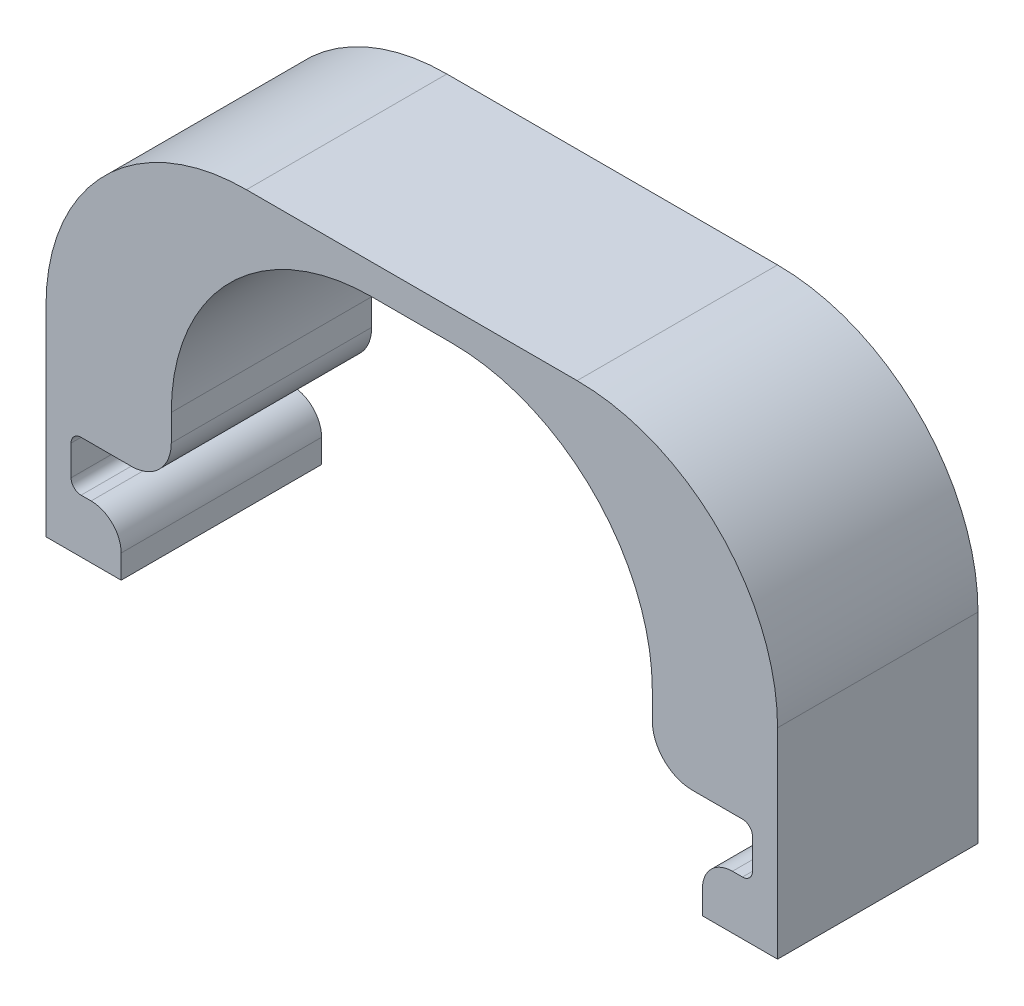
ISO-10303-21;
HEADER;
FILE_DESCRIPTION(('STEP AP214'),'2;1');
FILE_NAME('part.step','',(''),(''),'','','');
FILE_SCHEMA(('AUTOMOTIVE_DESIGN { 1 0 10303 214 1 1 1 1 }'));
ENDSEC;
DATA;
#1=APPLICATION_CONTEXT('core data for automotive mechanical design processes');
#2=APPLICATION_PROTOCOL_DEFINITION('international standard','automotive_design',2000,#1);
#3=PRODUCT_CONTEXT('',#1,'mechanical');
#4=PRODUCT('Part','Part','',(#3));
#5=PRODUCT_RELATED_PRODUCT_CATEGORY('part','',(#4));
#6=PRODUCT_DEFINITION_FORMATION('','',#4);
#7=PRODUCT_DEFINITION_CONTEXT('part definition',#1,'design');
#8=PRODUCT_DEFINITION('design','',#6,#7);
#9=PRODUCT_DEFINITION_SHAPE('','',#8);
#10=(LENGTH_UNIT() NAMED_UNIT(*) SI_UNIT(.MILLI.,.METRE.));
#11=(NAMED_UNIT(*) PLANE_ANGLE_UNIT() SI_UNIT($,.RADIAN.));
#12=(NAMED_UNIT(*) SI_UNIT($,.STERADIAN.) SOLID_ANGLE_UNIT());
#13=UNCERTAINTY_MEASURE_WITH_UNIT(LENGTH_MEASURE(1.E-05),#10,'distance_accuracy_value','');
#14=(GEOMETRIC_REPRESENTATION_CONTEXT(3) GLOBAL_UNCERTAINTY_ASSIGNED_CONTEXT((#13)) GLOBAL_UNIT_ASSIGNED_CONTEXT((#10,
#11,#12)) REPRESENTATION_CONTEXT('',''));
#15=CARTESIAN_POINT('',(0.,0.,0.));
#16=DIRECTION('',(0.,0.,1.));
#17=DIRECTION('',(1.,0.,0.));
#18=AXIS2_PLACEMENT_3D('',#15,#16,#17);
#19=CARTESIAN_POINT('',(0.,0.,0.));
#20=DIRECTION('',(0.,1.,0.));
#21=DIRECTION('',(0.,0.,1.));
#22=AXIS2_PLACEMENT_3D('',#19,#20,#21);
#23=PLANE('',#22);
#24=DIRECTION('',(-1.,0.,0.));
#25=VECTOR('',#24,1.);
#26=CARTESIAN_POINT('',(36.5,0.,-10.));
#27=LINE('',#26,#25);
#28=CARTESIAN_POINT('',(-29.,0.,-10.));
#29=VERTEX_POINT('',#28);
#30=CARTESIAN_POINT('',(-36.5,0.,-9.99999999999999));
#31=VERTEX_POINT('',#30);
#32=EDGE_CURVE('E466',#29,#31,#27,.T.);
#33=ORIENTED_EDGE('',*,*,#32,.F.);
#34=DIRECTION('',(0.,0.,1.));
#35=VECTOR('',#34,1.);
#36=CARTESIAN_POINT('',(-29.,0.,-10.));
#37=LINE('',#36,#35);
#38=CARTESIAN_POINT('',(-29.,0.,10.));
#39=VERTEX_POINT('',#38);
#40=EDGE_CURVE('E393',#29,#39,#37,.T.);
#41=ORIENTED_EDGE('',*,*,#40,.T.);
#42=DIRECTION('',(1.,0.,0.));
#43=VECTOR('',#42,1.);
#44=CARTESIAN_POINT('',(36.5,0.,10.));
#45=LINE('',#44,#43);
#46=CARTESIAN_POINT('',(-36.5,0.,10.));
#47=VERTEX_POINT('',#46);
#48=EDGE_CURVE('E458',#47,#39,#45,.T.);
#49=ORIENTED_EDGE('',*,*,#48,.F.);
#50=DIRECTION('',(0.,0.,1.));
#51=VECTOR('',#50,1.);
#52=CARTESIAN_POINT('',(-36.5,0.,10.));
#53=LINE('',#52,#51);
#54=EDGE_CURVE('E397',#31,#47,#53,.T.);
#55=ORIENTED_EDGE('',*,*,#54,.F.);
#56=EDGE_LOOP('',(#33,#41,#49,#55));
#57=FACE_BOUND('',#56,.T.);
#58=ADVANCED_FACE('F43',(#57),#23,.F.);
#59=CARTESIAN_POINT('',(-36.5,40.,10.));
#60=DIRECTION('',(1.,0.,0.));
#61=DIRECTION('',(0.,0.,-1.));
#62=AXIS2_PLACEMENT_3D('',#59,#60,#61);
#63=PLANE('',#62);
#64=DIRECTION('',(0.,-1.,0.));
#65=VECTOR('',#64,1.);
#66=CARTESIAN_POINT('',(-36.5,40.,10.));
#67=LINE('',#66,#65);
#68=CARTESIAN_POINT('',(-36.5,20.,10.));
#69=VERTEX_POINT('',#68);
#70=EDGE_CURVE('E477',#69,#47,#67,.T.);
#71=ORIENTED_EDGE('',*,*,#70,.F.);
#72=DIRECTION('',(0.,0.,1.));
#73=VECTOR('',#72,1.);
#74=CARTESIAN_POINT('',(-36.5,20.,-9.99999999999999));
#75=LINE('',#74,#73);
#76=CARTESIAN_POINT('',(-36.5,20.,-9.99999999999999));
#77=VERTEX_POINT('',#76);
#78=EDGE_CURVE('E503',#69,#77,#75,.F.);
#79=ORIENTED_EDGE('',*,*,#78,.T.);
#80=DIRECTION('',(0.,-1.,0.));
#81=VECTOR('',#80,1.);
#82=CARTESIAN_POINT('',(-36.5,40.,-9.99999999999999));
#83=LINE('',#82,#81);
#84=EDGE_CURVE('E453',#77,#31,#83,.T.);
#85=ORIENTED_EDGE('',*,*,#84,.T.);
#86=ORIENTED_EDGE('',*,*,#54,.T.);
#87=EDGE_LOOP('',(#71,#79,#85,#86));
#88=FACE_BOUND('',#87,.T.);
#89=ADVANCED_FACE('F578',(#88),#63,.F.);
#90=CARTESIAN_POINT('',(36.5,40.,10.));
#91=DIRECTION('',(0.,0.,-1.));
#92=DIRECTION('',(-1.,0.,0.));
#93=AXIS2_PLACEMENT_3D('',#90,#91,#92);
#94=PLANE('',#93);
#95=DIRECTION('',(0.,-1.,0.));
#96=VECTOR('',#95,1.);
#97=CARTESIAN_POINT('',(36.5,40.,10.));
#98=LINE('',#97,#96);
#99=CARTESIAN_POINT('',(36.5,20.,10.));
#100=VERTEX_POINT('',#99);
#101=CARTESIAN_POINT('',(36.5,0.,10.));
#102=VERTEX_POINT('',#101);
#103=EDGE_CURVE('E474',#100,#102,#98,.T.);
#104=ORIENTED_EDGE('',*,*,#103,.F.);
#105=CARTESIAN_POINT('',(16.5,20.,10.));
#106=DIRECTION('',(0.,0.,-1.));
#107=DIRECTION('',(-1.,0.,0.));
#108=AXIS2_PLACEMENT_3D('',#105,#106,#107);
#109=CIRCLE('',#108,20.);
#110=CARTESIAN_POINT('',(16.5,40.,10.));
#111=VERTEX_POINT('',#110);
#112=EDGE_CURVE('E500',#100,#111,#109,.F.);
#113=ORIENTED_EDGE('',*,*,#112,.T.);
#114=DIRECTION('',(1.,0.,0.));
#115=VECTOR('',#114,1.);
#116=CARTESIAN_POINT('',(36.5,40.,10.));
#117=LINE('',#116,#115);
#118=CARTESIAN_POINT('',(-16.5,40.,10.));
#119=VERTEX_POINT('',#118);
#120=EDGE_CURVE('E445',#119,#111,#117,.T.);
#121=ORIENTED_EDGE('',*,*,#120,.F.);
#122=CARTESIAN_POINT('',(-16.5,20.,10.));
#123=DIRECTION('',(0.,0.,-1.));
#124=DIRECTION('',(-1.,0.,0.));
#125=AXIS2_PLACEMENT_3D('',#122,#123,#124);
#126=CIRCLE('',#125,20.);
#127=EDGE_CURVE('E497',#119,#69,#126,.F.);
#128=ORIENTED_EDGE('',*,*,#127,.T.);
#129=ORIENTED_EDGE('',*,*,#70,.T.);
#130=ORIENTED_EDGE('',*,*,#48,.T.);
#131=DIRECTION('',(0.,-1.,0.));
#132=VECTOR('',#131,1.);
#133=CARTESIAN_POINT('',(-29.,0.,10.));
#134=LINE('',#133,#132);
#135=CARTESIAN_POINT('',(-29.,2.35242143726312,10.));
#136=VERTEX_POINT('',#135);
#137=EDGE_CURVE('E256',#136,#39,#134,.T.);
#138=ORIENTED_EDGE('',*,*,#137,.F.);
#139=CARTESIAN_POINT('',(-32.,2.35242143726312,10.));
#140=DIRECTION('',(0.,0.,-1.));
#141=DIRECTION('',(1.,0.,0.));
#142=AXIS2_PLACEMENT_3D('',#139,#140,#141);
#143=CIRCLE('',#142,3.);
#144=CARTESIAN_POINT('',(-32.,5.35242143726311,10.));
#145=VERTEX_POINT('',#144);
#146=EDGE_CURVE('E259',#145,#136,#143,.T.);
#147=ORIENTED_EDGE('',*,*,#146,.F.);
#148=DIRECTION('',(1.,0.,0.));
#149=VECTOR('',#148,1.);
#150=CARTESIAN_POINT('',(-32.,5.35242143726312,10.));
#151=LINE('',#150,#149);
#152=CARTESIAN_POINT('',(-33.,5.35242143726312,10.));
#153=VERTEX_POINT('',#152);
#154=EDGE_CURVE('E386',#153,#145,#151,.T.);
#155=ORIENTED_EDGE('',*,*,#154,.F.);
#156=CARTESIAN_POINT('',(-33.,6.35242143726312,10.));
#157=DIRECTION('',(0.,0.,1.));
#158=DIRECTION('',(-1.,0.,0.));
#159=AXIS2_PLACEMENT_3D('',#156,#157,#158);
#160=CIRCLE('',#159,1.);
#161=CARTESIAN_POINT('',(-34.,6.35242143726312,10.));
#162=VERTEX_POINT('',#161);
#163=EDGE_CURVE('E382',#162,#153,#160,.T.);
#164=ORIENTED_EDGE('',*,*,#163,.F.);
#165=DIRECTION('',(0.,-1.,0.));
#166=VECTOR('',#165,1.);
#167=CARTESIAN_POINT('',(-34.,6.35242143726312,10.));
#168=LINE('',#167,#166);
#169=CARTESIAN_POINT('',(-34.,9.35242143726311,10.));
#170=VERTEX_POINT('',#169);
#171=EDGE_CURVE('E378',#170,#162,#168,.T.);
#172=ORIENTED_EDGE('',*,*,#171,.F.);
#173=CARTESIAN_POINT('',(-33.,9.35242143726311,10.));
#174=DIRECTION('',(0.,0.,1.));
#175=DIRECTION('',(-1.,0.,0.));
#176=AXIS2_PLACEMENT_3D('',#173,#174,#175);
#177=CIRCLE('',#176,1.);
#178=CARTESIAN_POINT('',(-33.,10.3524214372631,10.));
#179=VERTEX_POINT('',#178);
#180=EDGE_CURVE('E374',#179,#170,#177,.T.);
#181=ORIENTED_EDGE('',*,*,#180,.F.);
#182=DIRECTION('',(-1.,0.,0.));
#183=VECTOR('',#182,1.);
#184=CARTESIAN_POINT('',(-33.,10.3524214372631,10.));
#185=LINE('',#184,#183);
#186=CARTESIAN_POINT('',(-28.,10.3524214372631,10.));
#187=VERTEX_POINT('',#186);
#188=EDGE_CURVE('E370',#187,#179,#185,.T.);
#189=ORIENTED_EDGE('',*,*,#188,.F.);
#190=CARTESIAN_POINT('',(-28.,14.3524214372631,10.));
#191=DIRECTION('',(0.,0.,-1.));
#192=DIRECTION('',(1.,0.,0.));
#193=AXIS2_PLACEMENT_3D('',#190,#191,#192);
#194=CIRCLE('',#193,4.);
#195=CARTESIAN_POINT('',(-24.,14.3524214372631,10.));
#196=VERTEX_POINT('',#195);
#197=EDGE_CURVE('E366',#196,#187,#194,.T.);
#198=ORIENTED_EDGE('',*,*,#197,.F.);
#199=DIRECTION('',(0.,-1.,0.));
#200=VECTOR('',#199,1.);
#201=CARTESIAN_POINT('',(-24.,14.3524214372631,10.));
#202=LINE('',#201,#200);
#203=CARTESIAN_POINT('',(-24.,17.,10.));
#204=VERTEX_POINT('',#203);
#205=EDGE_CURVE('E363',#204,#196,#202,.T.);
#206=ORIENTED_EDGE('',*,*,#205,.F.);
#207=CARTESIAN_POINT('',(-4.,17.,10.));
#208=DIRECTION('',(0.,0.,-1.));
#209=DIRECTION('',(-1.,0.,0.));
#210=AXIS2_PLACEMENT_3D('',#207,#208,#209);
#211=CIRCLE('',#210,20.);
#212=CARTESIAN_POINT('',(-4.,37.,10.));
#213=VERTEX_POINT('',#212);
#214=EDGE_CURVE('E52',#204,#213,#211,.T.);
#215=ORIENTED_EDGE('',*,*,#214,.T.);
#216=DIRECTION('',(-1.,0.,0.));
#217=VECTOR('',#216,1.);
#218=CARTESIAN_POINT('',(-24.,37.,10.));
#219=LINE('',#218,#217);
#220=CARTESIAN_POINT('',(4.00000000000001,37.,10.));
#221=VERTEX_POINT('',#220);
#222=EDGE_CURVE('E359',#221,#213,#219,.T.);
#223=ORIENTED_EDGE('',*,*,#222,.F.);
#224=CARTESIAN_POINT('',(4.00000000000002,17.,10.));
#225=DIRECTION('',(0.,0.,-1.));
#226=DIRECTION('',(-1.,0.,0.));
#227=AXIS2_PLACEMENT_3D('',#224,#225,#226);
#228=CIRCLE('',#227,20.);
#229=CARTESIAN_POINT('',(24.,17.,10.));
#230=VERTEX_POINT('',#229);
#231=EDGE_CURVE('E519',#221,#230,#228,.T.);
#232=ORIENTED_EDGE('',*,*,#231,.T.);
#233=DIRECTION('',(0.,1.,0.));
#234=VECTOR('',#233,1.);
#235=CARTESIAN_POINT('',(24.,14.3524214372631,10.));
#236=LINE('',#235,#234);
#237=CARTESIAN_POINT('',(24.,14.3524214372631,10.));
#238=VERTEX_POINT('',#237);
#239=EDGE_CURVE('E355',#238,#230,#236,.T.);
#240=ORIENTED_EDGE('',*,*,#239,.F.);
#241=CARTESIAN_POINT('',(28.,14.3524214372631,10.));
#242=DIRECTION('',(0.,0.,-1.));
#243=DIRECTION('',(-1.,0.,0.));
#244=AXIS2_PLACEMENT_3D('',#241,#242,#243);
#245=CIRCLE('',#244,4.);
#246=CARTESIAN_POINT('',(28.,10.3524214372631,10.));
#247=VERTEX_POINT('',#246);
#248=EDGE_CURVE('E351',#247,#238,#245,.T.);
#249=ORIENTED_EDGE('',*,*,#248,.F.);
#250=DIRECTION('',(-1.,0.,0.));
#251=VECTOR('',#250,1.);
#252=CARTESIAN_POINT('',(31.,10.3524214372631,10.));
#253=LINE('',#252,#251);
#254=CARTESIAN_POINT('',(33.,10.3524214372631,10.));
#255=VERTEX_POINT('',#254);
#256=EDGE_CURVE('E347',#255,#247,#253,.T.);
#257=ORIENTED_EDGE('',*,*,#256,.F.);
#258=CARTESIAN_POINT('',(33.,9.35242143726306,10.));
#259=DIRECTION('',(0.,0.,1.));
#260=DIRECTION('',(1.,0.,0.));
#261=AXIS2_PLACEMENT_3D('',#258,#259,#260);
#262=CIRCLE('',#261,1.);
#263=CARTESIAN_POINT('',(34.,9.35242143726306,10.));
#264=VERTEX_POINT('',#263);
#265=EDGE_CURVE('E343',#264,#255,#262,.T.);
#266=ORIENTED_EDGE('',*,*,#265,.F.);
#267=DIRECTION('',(0.,1.,0.));
#268=VECTOR('',#267,1.);
#269=CARTESIAN_POINT('',(34.,6.35242143726306,10.));
#270=LINE('',#269,#268);
#271=CARTESIAN_POINT('',(34.,6.35242143726306,10.));
#272=VERTEX_POINT('',#271);
#273=EDGE_CURVE('E339',#272,#264,#270,.T.);
#274=ORIENTED_EDGE('',*,*,#273,.F.);
#275=CARTESIAN_POINT('',(33.,6.35242143726306,10.));
#276=DIRECTION('',(0.,0.,1.));
#277=DIRECTION('',(1.,0.,0.));
#278=AXIS2_PLACEMENT_3D('',#275,#276,#277);
#279=CIRCLE('',#278,1.);
#280=CARTESIAN_POINT('',(33.,5.35242143726306,10.));
#281=VERTEX_POINT('',#280);
#282=EDGE_CURVE('E335',#281,#272,#279,.T.);
#283=ORIENTED_EDGE('',*,*,#282,.F.);
#284=DIRECTION('',(1.,0.,0.));
#285=VECTOR('',#284,1.);
#286=CARTESIAN_POINT('',(32.,5.35242143726307,10.));
#287=LINE('',#286,#285);
#288=CARTESIAN_POINT('',(32.,5.35242143726307,10.));
#289=VERTEX_POINT('',#288);
#290=EDGE_CURVE('E331',#289,#281,#287,.T.);
#291=ORIENTED_EDGE('',*,*,#290,.F.);
#292=CARTESIAN_POINT('',(32.,2.35242143726307,10.));
#293=DIRECTION('',(0.,0.,-1.));
#294=DIRECTION('',(-1.,0.,0.));
#295=AXIS2_PLACEMENT_3D('',#292,#293,#294);
#296=CIRCLE('',#295,3.);
#297=CARTESIAN_POINT('',(29.,2.35242143726307,10.));
#298=VERTEX_POINT('',#297);
#299=EDGE_CURVE('E328',#298,#289,#296,.T.);
#300=ORIENTED_EDGE('',*,*,#299,.F.);
#301=DIRECTION('',(0.,1.,0.));
#302=VECTOR('',#301,1.);
#303=CARTESIAN_POINT('',(29.,0.,10.));
#304=LINE('',#303,#302);
#305=CARTESIAN_POINT('',(29.,0.,10.));
#306=VERTEX_POINT('',#305);
#307=EDGE_CURVE('E234',#306,#298,#304,.T.);
#308=ORIENTED_EDGE('',*,*,#307,.F.);
#309=EDGE_CURVE('E457',#306,#102,#45,.T.);
#310=ORIENTED_EDGE('',*,*,#309,.T.);
#311=EDGE_LOOP('',(#104,#113,#121,#128,#129,#130,#138,#147,#155,#164,#172,#181,#189,#198,#206,
#215,#223,#232,#240,#249,#257,#266,#274,#283,#291,#300,#308,#310));
#312=FACE_BOUND('',#311,.T.);
#313=ADVANCED_FACE('F529',(#312),#94,.F.);
#314=CARTESIAN_POINT('',(36.5,40.,10.));
#315=DIRECTION('',(-1.,0.,0.));
#316=DIRECTION('',(0.,0.,1.));
#317=AXIS2_PLACEMENT_3D('',#314,#315,#316);
#318=PLANE('',#317);
#319=DIRECTION('',(0.,-1.,0.));
#320=VECTOR('',#319,1.);
#321=CARTESIAN_POINT('',(36.5,40.,-10.));
#322=LINE('',#321,#320);
#323=CARTESIAN_POINT('',(36.5,20.,-10.));
#324=VERTEX_POINT('',#323);
#325=CARTESIAN_POINT('',(36.5,0.,-10.));
#326=VERTEX_POINT('',#325);
#327=EDGE_CURVE('E471',#324,#326,#322,.T.);
#328=ORIENTED_EDGE('',*,*,#327,.F.);
#329=DIRECTION('',(0.,0.,-1.));
#330=VECTOR('',#329,1.);
#331=CARTESIAN_POINT('',(36.5,20.,10.));
#332=LINE('',#331,#330);
#333=EDGE_CURVE('E494',#324,#100,#332,.F.);
#334=ORIENTED_EDGE('',*,*,#333,.T.);
#335=ORIENTED_EDGE('',*,*,#103,.T.);
#336=DIRECTION('',(0.,0.,-1.));
#337=VECTOR('',#336,1.);
#338=CARTESIAN_POINT('',(36.5,0.,10.));
#339=LINE('',#338,#337);
#340=EDGE_CURVE('E462',#102,#326,#339,.T.);
#341=ORIENTED_EDGE('',*,*,#340,.T.);
#342=EDGE_LOOP('',(#328,#334,#335,#341));
#343=FACE_BOUND('',#342,.T.);
#344=ADVANCED_FACE('F593',(#343),#318,.F.);
#345=CARTESIAN_POINT('',(36.5,40.,-10.));
#346=DIRECTION('',(0.,0.,1.));
#347=DIRECTION('',(1.,0.,0.));
#348=AXIS2_PLACEMENT_3D('',#345,#346,#347);
#349=PLANE('',#348);
#350=DIRECTION('',(-1.,0.,0.));
#351=VECTOR('',#350,1.);
#352=CARTESIAN_POINT('',(36.5,40.,-10.));
#353=LINE('',#352,#351);
#354=CARTESIAN_POINT('',(16.5,40.,-10.));
#355=VERTEX_POINT('',#354);
#356=CARTESIAN_POINT('',(-16.5,40.,-9.99999999999999));
#357=VERTEX_POINT('',#356);
#358=EDGE_CURVE('E449',#355,#357,#353,.T.);
#359=ORIENTED_EDGE('',*,*,#358,.F.);
#360=CARTESIAN_POINT('',(16.5,20.,-10.));
#361=DIRECTION('',(0.,0.,1.));
#362=DIRECTION('',(1.,0.,0.));
#363=AXIS2_PLACEMENT_3D('',#360,#361,#362);
#364=CIRCLE('',#363,20.);
#365=EDGE_CURVE('E491',#355,#324,#364,.F.);
#366=ORIENTED_EDGE('',*,*,#365,.T.);
#367=ORIENTED_EDGE('',*,*,#327,.T.);
#368=CARTESIAN_POINT('',(29.,0.,-10.));
#369=VERTEX_POINT('',#368);
#370=EDGE_CURVE('E254',#326,#369,#27,.T.);
#371=ORIENTED_EDGE('',*,*,#370,.T.);
#372=DIRECTION('',(0.,1.,0.));
#373=VECTOR('',#372,1.);
#374=CARTESIAN_POINT('',(29.,0.,-10.));
#375=LINE('',#374,#373);
#376=CARTESIAN_POINT('',(29.,2.35242143726307,-10.));
#377=VERTEX_POINT('',#376);
#378=EDGE_CURVE('E231',#369,#377,#375,.T.);
#379=ORIENTED_EDGE('',*,*,#378,.T.);
#380=CARTESIAN_POINT('',(32.,2.35242143726307,-10.));
#381=DIRECTION('',(0.,0.,-1.));
#382=DIRECTION('',(-1.,0.,0.));
#383=AXIS2_PLACEMENT_3D('',#380,#381,#382);
#384=CIRCLE('',#383,3.);
#385=CARTESIAN_POINT('',(32.,5.35242143726307,-10.));
#386=VERTEX_POINT('',#385);
#387=EDGE_CURVE('E243',#377,#386,#384,.T.);
#388=ORIENTED_EDGE('',*,*,#387,.T.);
#389=DIRECTION('',(1.,0.,0.));
#390=VECTOR('',#389,1.);
#391=CARTESIAN_POINT('',(32.,5.35242143726307,-10.));
#392=LINE('',#391,#390);
#393=CARTESIAN_POINT('',(33.,5.35242143726306,-10.));
#394=VERTEX_POINT('',#393);
#395=EDGE_CURVE('E248',#386,#394,#392,.T.);
#396=ORIENTED_EDGE('',*,*,#395,.T.);
#397=CARTESIAN_POINT('',(33.,6.35242143726306,-10.));
#398=DIRECTION('',(0.,0.,1.));
#399=DIRECTION('',(1.,0.,0.));
#400=AXIS2_PLACEMENT_3D('',#397,#398,#399);
#401=CIRCLE('',#400,1.);
#402=CARTESIAN_POINT('',(34.,6.35242143726306,-10.));
#403=VERTEX_POINT('',#402);
#404=EDGE_CURVE('E264',#394,#403,#401,.T.);
#405=ORIENTED_EDGE('',*,*,#404,.T.);
#406=DIRECTION('',(0.,1.,0.));
#407=VECTOR('',#406,1.);
#408=CARTESIAN_POINT('',(34.,6.35242143726306,-10.));
#409=LINE('',#408,#407);
#410=CARTESIAN_POINT('',(34.,9.35242143726306,-10.));
#411=VERTEX_POINT('',#410);
#412=EDGE_CURVE('E268',#403,#411,#409,.T.);
#413=ORIENTED_EDGE('',*,*,#412,.T.);
#414=CARTESIAN_POINT('',(33.,9.35242143726306,-10.));
#415=DIRECTION('',(0.,0.,1.));
#416=DIRECTION('',(1.,0.,0.));
#417=AXIS2_PLACEMENT_3D('',#414,#415,#416);
#418=CIRCLE('',#417,1.);
#419=CARTESIAN_POINT('',(33.,10.3524214372631,-10.));
#420=VERTEX_POINT('',#419);
#421=EDGE_CURVE('E272',#411,#420,#418,.T.);
#422=ORIENTED_EDGE('',*,*,#421,.T.);
#423=DIRECTION('',(-1.,0.,0.));
#424=VECTOR('',#423,1.);
#425=CARTESIAN_POINT('',(33.,10.3524214372631,-10.));
#426=LINE('',#425,#424);
#427=CARTESIAN_POINT('',(28.,10.3524214372631,-10.));
#428=VERTEX_POINT('',#427);
#429=EDGE_CURVE('E276',#420,#428,#426,.T.);
#430=ORIENTED_EDGE('',*,*,#429,.T.);
#431=CARTESIAN_POINT('',(28.,14.3524214372631,-10.));
#432=DIRECTION('',(0.,0.,-1.));
#433=DIRECTION('',(-1.,0.,0.));
#434=AXIS2_PLACEMENT_3D('',#431,#432,#433);
#435=CIRCLE('',#434,4.);
#436=CARTESIAN_POINT('',(24.,14.3524214372631,-10.));
#437=VERTEX_POINT('',#436);
#438=EDGE_CURVE('E280',#428,#437,#435,.T.);
#439=ORIENTED_EDGE('',*,*,#438,.T.);
#440=DIRECTION('',(0.,1.,0.));
#441=VECTOR('',#440,1.);
#442=CARTESIAN_POINT('',(24.,14.3524214372631,-10.));
#443=LINE('',#442,#441);
#444=CARTESIAN_POINT('',(24.,17.,-10.));
#445=VERTEX_POINT('',#444);
#446=EDGE_CURVE('E284',#437,#445,#443,.T.);
#447=ORIENTED_EDGE('',*,*,#446,.T.);
#448=CARTESIAN_POINT('',(4.00000000000002,17.,-10.));
#449=DIRECTION('',(0.,0.,1.));
#450=DIRECTION('',(1.,0.,0.));
#451=AXIS2_PLACEMENT_3D('',#448,#449,#450);
#452=CIRCLE('',#451,20.);
#453=CARTESIAN_POINT('',(4.00000000000001,37.,-10.));
#454=VERTEX_POINT('',#453);
#455=EDGE_CURVE('E522',#445,#454,#452,.T.);
#456=ORIENTED_EDGE('',*,*,#455,.T.);
#457=DIRECTION('',(-1.,0.,0.));
#458=VECTOR('',#457,1.);
#459=CARTESIAN_POINT('',(-24.,37.,-10.));
#460=LINE('',#459,#458);
#461=CARTESIAN_POINT('',(-4.,37.,-10.));
#462=VERTEX_POINT('',#461);
#463=EDGE_CURVE('E288',#454,#462,#460,.T.);
#464=ORIENTED_EDGE('',*,*,#463,.T.);
#465=CARTESIAN_POINT('',(-4.,17.,-10.));
#466=DIRECTION('',(0.,0.,1.));
#467=DIRECTION('',(1.,0.,0.));
#468=AXIS2_PLACEMENT_3D('',#465,#466,#467);
#469=CIRCLE('',#468,20.);
#470=CARTESIAN_POINT('',(-24.,17.,-10.));
#471=VERTEX_POINT('',#470);
#472=EDGE_CURVE('E11',#462,#471,#469,.T.);
#473=ORIENTED_EDGE('',*,*,#472,.T.);
#474=DIRECTION('',(0.,-1.,0.));
#475=VECTOR('',#474,1.);
#476=CARTESIAN_POINT('',(-24.,14.3524214372631,-10.));
#477=LINE('',#476,#475);
#478=CARTESIAN_POINT('',(-24.,14.3524214372631,-10.));
#479=VERTEX_POINT('',#478);
#480=EDGE_CURVE('E291',#471,#479,#477,.T.);
#481=ORIENTED_EDGE('',*,*,#480,.T.);
#482=CARTESIAN_POINT('',(-28.,14.3524214372631,-10.));
#483=DIRECTION('',(0.,0.,-1.));
#484=DIRECTION('',(1.,0.,0.));
#485=AXIS2_PLACEMENT_3D('',#482,#483,#484);
#486=CIRCLE('',#485,4.);
#487=CARTESIAN_POINT('',(-28.,10.3524214372631,-10.));
#488=VERTEX_POINT('',#487);
#489=EDGE_CURVE('E294',#479,#488,#486,.T.);
#490=ORIENTED_EDGE('',*,*,#489,.T.);
#491=DIRECTION('',(-1.,0.,0.));
#492=VECTOR('',#491,1.);
#493=CARTESIAN_POINT('',(-31.,10.3524214372631,-10.));
#494=LINE('',#493,#492);
#495=CARTESIAN_POINT('',(-33.,10.3524214372631,-10.));
#496=VERTEX_POINT('',#495);
#497=EDGE_CURVE('E298',#488,#496,#494,.T.);
#498=ORIENTED_EDGE('',*,*,#497,.T.);
#499=CARTESIAN_POINT('',(-33.,9.35242143726311,-10.));
#500=DIRECTION('',(0.,0.,1.));
#501=DIRECTION('',(-1.,0.,0.));
#502=AXIS2_PLACEMENT_3D('',#499,#500,#501);
#503=CIRCLE('',#502,1.);
#504=CARTESIAN_POINT('',(-34.,9.35242143726311,-10.));
#505=VERTEX_POINT('',#504);
#506=EDGE_CURVE('E302',#496,#505,#503,.T.);
#507=ORIENTED_EDGE('',*,*,#506,.T.);
#508=DIRECTION('',(0.,-1.,0.));
#509=VECTOR('',#508,1.);
#510=CARTESIAN_POINT('',(-34.,6.35242143726312,-10.));
#511=LINE('',#510,#509);
#512=CARTESIAN_POINT('',(-34.,6.35242143726312,-10.));
#513=VERTEX_POINT('',#512);
#514=EDGE_CURVE('E306',#505,#513,#511,.T.);
#515=ORIENTED_EDGE('',*,*,#514,.T.);
#516=CARTESIAN_POINT('',(-33.,6.35242143726312,-10.));
#517=DIRECTION('',(0.,0.,1.));
#518=DIRECTION('',(-1.,0.,0.));
#519=AXIS2_PLACEMENT_3D('',#516,#517,#518);
#520=CIRCLE('',#519,1.);
#521=CARTESIAN_POINT('',(-33.,5.35242143726312,-10.));
#522=VERTEX_POINT('',#521);
#523=EDGE_CURVE('E310',#513,#522,#520,.T.);
#524=ORIENTED_EDGE('',*,*,#523,.T.);
#525=DIRECTION('',(1.,0.,0.));
#526=VECTOR('',#525,1.);
#527=CARTESIAN_POINT('',(-32.,5.35242143726312,-10.));
#528=LINE('',#527,#526);
#529=CARTESIAN_POINT('',(-32.,5.35242143726311,-10.));
#530=VERTEX_POINT('',#529);
#531=EDGE_CURVE('E314',#522,#530,#528,.T.);
#532=ORIENTED_EDGE('',*,*,#531,.T.);
#533=CARTESIAN_POINT('',(-32.,2.35242143726312,-10.));
#534=DIRECTION('',(0.,0.,-1.));
#535=DIRECTION('',(1.,0.,0.));
#536=AXIS2_PLACEMENT_3D('',#533,#534,#535);
#537=CIRCLE('',#536,3.);
#538=CARTESIAN_POINT('',(-29.,2.35242143726312,-10.));
#539=VERTEX_POINT('',#538);
#540=EDGE_CURVE('E318',#530,#539,#537,.T.);
#541=ORIENTED_EDGE('',*,*,#540,.T.);
#542=DIRECTION('',(0.,-1.,0.));
#543=VECTOR('',#542,1.);
#544=CARTESIAN_POINT('',(-29.,0.,-10.));
#545=LINE('',#544,#543);
#546=EDGE_CURVE('E322',#539,#29,#545,.T.);
#547=ORIENTED_EDGE('',*,*,#546,.T.);
#548=ORIENTED_EDGE('',*,*,#32,.T.);
#549=ORIENTED_EDGE('',*,*,#84,.F.);
#550=CARTESIAN_POINT('',(-16.5,20.,-9.99999999999999));
#551=DIRECTION('',(0.,0.,1.));
#552=DIRECTION('',(1.,0.,0.));
#553=AXIS2_PLACEMENT_3D('',#550,#551,#552);
#554=CIRCLE('',#553,20.);
#555=EDGE_CURVE('E488',#77,#357,#554,.F.);
#556=ORIENTED_EDGE('',*,*,#555,.T.);
#557=EDGE_LOOP('',(#359,#366,#367,#371,#379,#388,#396,#405,#413,#422,#430,#439,#447,#456,#464,
#473,#481,#490,#498,#507,#515,#524,#532,#541,#547,#548,#549,#556));
#558=FACE_BOUND('',#557,.T.);
#559=ADVANCED_FACE('F252',(#558),#349,.F.);
#560=CARTESIAN_POINT('',(0.,40.,0.));
#561=DIRECTION('',(0.,1.,0.));
#562=DIRECTION('',(0.,0.,1.));
#563=AXIS2_PLACEMENT_3D('',#560,#561,#562);
#564=PLANE('',#563);
#565=ORIENTED_EDGE('',*,*,#120,.T.);
#566=DIRECTION('',(0.,0.,-1.));
#567=VECTOR('',#566,1.);
#568=CARTESIAN_POINT('',(16.5,40.,-10.));
#569=LINE('',#568,#567);
#570=EDGE_CURVE('E484',#111,#355,#569,.T.);
#571=ORIENTED_EDGE('',*,*,#570,.T.);
#572=ORIENTED_EDGE('',*,*,#358,.T.);
#573=DIRECTION('',(0.,0.,1.));
#574=VECTOR('',#573,1.);
#575=CARTESIAN_POINT('',(-16.5,40.,10.));
#576=LINE('',#575,#574);
#577=EDGE_CURVE('E480',#357,#119,#576,.T.);
#578=ORIENTED_EDGE('',*,*,#577,.T.);
#579=EDGE_LOOP('',(#565,#571,#572,#578));
#580=FACE_BOUND('',#579,.T.);
#581=ADVANCED_FACE('F585',(#580),#564,.T.);
#582=ORIENTED_EDGE('',*,*,#309,.F.);
#583=DIRECTION('',(0.,0.,1.));
#584=VECTOR('',#583,1.);
#585=CARTESIAN_POINT('',(29.,0.,-10.));
#586=LINE('',#585,#584);
#587=EDGE_CURVE('E240',#369,#306,#586,.T.);
#588=ORIENTED_EDGE('',*,*,#587,.F.);
#589=ORIENTED_EDGE('',*,*,#370,.F.);
#590=ORIENTED_EDGE('',*,*,#340,.F.);
#591=EDGE_LOOP('',(#582,#588,#589,#590));
#592=FACE_BOUND('',#591,.T.);
#593=ADVANCED_FACE('F598',(#592),#23,.F.);
#594=CARTESIAN_POINT('',(-29.,0.,-10.));
#595=DIRECTION('',(-1.,0.,0.));
#596=DIRECTION('',(0.,0.,1.));
#597=AXIS2_PLACEMENT_3D('',#594,#595,#596);
#598=PLANE('',#597);
#599=ORIENTED_EDGE('',*,*,#137,.T.);
#600=ORIENTED_EDGE('',*,*,#40,.F.);
#601=ORIENTED_EDGE('',*,*,#546,.F.);
#602=DIRECTION('',(0.,0.,1.));
#603=VECTOR('',#602,1.);
#604=CARTESIAN_POINT('',(-29.,2.35242143726312,-10.));
#605=LINE('',#604,#603);
#606=EDGE_CURVE('E398',#539,#136,#605,.T.);
#607=ORIENTED_EDGE('',*,*,#606,.T.);
#608=EDGE_LOOP('',(#599,#600,#601,#607));
#609=FACE_BOUND('',#608,.T.);
#610=ADVANCED_FACE('F570',(#609),#598,.F.);
#611=CARTESIAN_POINT('',(-32.,2.35242143726312,-10.));
#612=DIRECTION('',(0.,0.,1.));
#613=DIRECTION('',(1.,0.,0.));
#614=AXIS2_PLACEMENT_3D('',#611,#612,#613);
#615=CYLINDRICAL_SURFACE('',#614,3.);
#616=ORIENTED_EDGE('',*,*,#146,.T.);
#617=ORIENTED_EDGE('',*,*,#606,.F.);
#618=ORIENTED_EDGE('',*,*,#540,.F.);
#619=DIRECTION('',(0.,0.,1.));
#620=VECTOR('',#619,1.);
#621=CARTESIAN_POINT('',(-32.,5.35242143726311,-10.));
#622=LINE('',#621,#620);
#623=EDGE_CURVE('E401',#530,#145,#622,.T.);
#624=ORIENTED_EDGE('',*,*,#623,.T.);
#625=EDGE_LOOP('',(#616,#617,#618,#624));
#626=FACE_BOUND('',#625,.T.);
#627=ADVANCED_FACE('F566',(#626),#615,.T.);
#628=CARTESIAN_POINT('',(-32.,5.35242143726312,-10.));
#629=DIRECTION('',(0.,-1.,0.));
#630=DIRECTION('',(0.,0.,-1.));
#631=AXIS2_PLACEMENT_3D('',#628,#629,#630);
#632=PLANE('',#631);
#633=ORIENTED_EDGE('',*,*,#154,.T.);
#634=ORIENTED_EDGE('',*,*,#623,.F.);
#635=ORIENTED_EDGE('',*,*,#531,.F.);
#636=DIRECTION('',(0.,0.,1.));
#637=VECTOR('',#636,1.);
#638=CARTESIAN_POINT('',(-33.,5.35242143726312,-10.));
#639=LINE('',#638,#637);
#640=EDGE_CURVE('E404',#522,#153,#639,.T.);
#641=ORIENTED_EDGE('',*,*,#640,.T.);
#642=EDGE_LOOP('',(#633,#634,#635,#641));
#643=FACE_BOUND('',#642,.T.);
#644=ADVANCED_FACE('F560',(#643),#632,.F.);
#645=CARTESIAN_POINT('',(-33.,6.35242143726312,-10.));
#646=DIRECTION('',(0.,0.,1.));
#647=DIRECTION('',(1.,0.,0.));
#648=AXIS2_PLACEMENT_3D('',#645,#646,#647);
#649=CYLINDRICAL_SURFACE('',#648,1.);
#650=ORIENTED_EDGE('',*,*,#163,.T.);
#651=ORIENTED_EDGE('',*,*,#640,.F.);
#652=ORIENTED_EDGE('',*,*,#523,.F.);
#653=DIRECTION('',(0.,0.,1.));
#654=VECTOR('',#653,1.);
#655=CARTESIAN_POINT('',(-34.,6.35242143726312,-10.));
#656=LINE('',#655,#654);
#657=EDGE_CURVE('E407',#513,#162,#656,.T.);
#658=ORIENTED_EDGE('',*,*,#657,.T.);
#659=EDGE_LOOP('',(#650,#651,#652,#658));
#660=FACE_BOUND('',#659,.T.);
#661=ADVANCED_FACE('F556',(#660),#649,.F.);
#662=CARTESIAN_POINT('',(-34.,6.35242143726312,-10.));
#663=DIRECTION('',(-1.,0.,0.));
#664=DIRECTION('',(0.,0.,1.));
#665=AXIS2_PLACEMENT_3D('',#662,#663,#664);
#666=PLANE('',#665);
#667=ORIENTED_EDGE('',*,*,#171,.T.);
#668=ORIENTED_EDGE('',*,*,#657,.F.);
#669=ORIENTED_EDGE('',*,*,#514,.F.);
#670=DIRECTION('',(0.,0.,1.));
#671=VECTOR('',#670,1.);
#672=CARTESIAN_POINT('',(-34.,9.35242143726311,-10.));
#673=LINE('',#672,#671);
#674=EDGE_CURVE('E410',#505,#170,#673,.T.);
#675=ORIENTED_EDGE('',*,*,#674,.T.);
#676=EDGE_LOOP('',(#667,#668,#669,#675));
#677=FACE_BOUND('',#676,.T.);
#678=ADVANCED_FACE('F552',(#677),#666,.F.);
#679=CARTESIAN_POINT('',(-33.,9.35242143726311,-10.));
#680=DIRECTION('',(0.,0.,1.));
#681=DIRECTION('',(1.,0.,0.));
#682=AXIS2_PLACEMENT_3D('',#679,#680,#681);
#683=CYLINDRICAL_SURFACE('',#682,1.);
#684=ORIENTED_EDGE('',*,*,#180,.T.);
#685=ORIENTED_EDGE('',*,*,#674,.F.);
#686=ORIENTED_EDGE('',*,*,#506,.F.);
#687=DIRECTION('',(0.,0.,1.));
#688=VECTOR('',#687,1.);
#689=CARTESIAN_POINT('',(-33.,10.3524214372631,-10.));
#690=LINE('',#689,#688);
#691=EDGE_CURVE('E413',#496,#179,#690,.T.);
#692=ORIENTED_EDGE('',*,*,#691,.T.);
#693=EDGE_LOOP('',(#684,#685,#686,#692));
#694=FACE_BOUND('',#693,.T.);
#695=ADVANCED_FACE('F548',(#694),#683,.F.);
#696=CARTESIAN_POINT('',(-33.,10.3524214372631,-10.));
#697=DIRECTION('',(0.,1.,0.));
#698=DIRECTION('',(0.,0.,1.));
#699=AXIS2_PLACEMENT_3D('',#696,#697,#698);
#700=PLANE('',#699);
#701=ORIENTED_EDGE('',*,*,#188,.T.);
#702=ORIENTED_EDGE('',*,*,#691,.F.);
#703=ORIENTED_EDGE('',*,*,#497,.F.);
#704=DIRECTION('',(0.,0.,1.));
#705=VECTOR('',#704,1.);
#706=CARTESIAN_POINT('',(-28.,10.3524214372631,-10.));
#707=LINE('',#706,#705);
#708=EDGE_CURVE('E416',#488,#187,#707,.T.);
#709=ORIENTED_EDGE('',*,*,#708,.T.);
#710=EDGE_LOOP('',(#701,#702,#703,#709));
#711=FACE_BOUND('',#710,.T.);
#712=ADVANCED_FACE('F544',(#711),#700,.F.);
#713=CARTESIAN_POINT('',(-28.,14.3524214372631,-10.));
#714=DIRECTION('',(0.,0.,1.));
#715=DIRECTION('',(1.,0.,0.));
#716=AXIS2_PLACEMENT_3D('',#713,#714,#715);
#717=CYLINDRICAL_SURFACE('',#716,4.);
#718=ORIENTED_EDGE('',*,*,#197,.T.);
#719=ORIENTED_EDGE('',*,*,#708,.F.);
#720=ORIENTED_EDGE('',*,*,#489,.F.);
#721=DIRECTION('',(0.,0.,1.));
#722=VECTOR('',#721,1.);
#723=CARTESIAN_POINT('',(-24.,14.3524214372631,-10.));
#724=LINE('',#723,#722);
#725=EDGE_CURVE('E419',#479,#196,#724,.T.);
#726=ORIENTED_EDGE('',*,*,#725,.T.);
#727=EDGE_LOOP('',(#718,#719,#720,#726));
#728=FACE_BOUND('',#727,.T.);
#729=ADVANCED_FACE('F541',(#728),#717,.T.);
#730=CARTESIAN_POINT('',(-24.,14.3524214372631,-10.));
#731=DIRECTION('',(-1.,0.,0.));
#732=DIRECTION('',(0.,0.,1.));
#733=AXIS2_PLACEMENT_3D('',#730,#731,#732);
#734=PLANE('',#733);
#735=ORIENTED_EDGE('',*,*,#480,.F.);
#736=DIRECTION('',(0.,0.,1.));
#737=VECTOR('',#736,1.);
#738=CARTESIAN_POINT('',(-24.,17.,10.));
#739=LINE('',#738,#737);
#740=EDGE_CURVE('E516',#471,#204,#739,.T.);
#741=ORIENTED_EDGE('',*,*,#740,.T.);
#742=ORIENTED_EDGE('',*,*,#205,.T.);
#743=ORIENTED_EDGE('',*,*,#725,.F.);
#744=EDGE_LOOP('',(#735,#741,#742,#743));
#745=FACE_BOUND('',#744,.T.);
#746=ADVANCED_FACE('F536',(#745),#734,.F.);
#747=CARTESIAN_POINT('',(-24.,37.,-10.));
#748=DIRECTION('',(0.,1.,0.));
#749=DIRECTION('',(-1.,0.,0.));
#750=AXIS2_PLACEMENT_3D('',#747,#748,#749);
#751=PLANE('',#750);
#752=ORIENTED_EDGE('',*,*,#463,.F.);
#753=DIRECTION('',(0.,0.,1.));
#754=VECTOR('',#753,1.);
#755=CARTESIAN_POINT('',(4.00000000000002,37.,10.));
#756=LINE('',#755,#754);
#757=EDGE_CURVE('E509',#454,#221,#756,.T.);
#758=ORIENTED_EDGE('',*,*,#757,.T.);
#759=ORIENTED_EDGE('',*,*,#222,.T.);
#760=DIRECTION('',(0.,0.,1.));
#761=VECTOR('',#760,1.);
#762=CARTESIAN_POINT('',(-4.,37.,-10.));
#763=LINE('',#762,#761);
#764=EDGE_CURVE('E506',#213,#462,#763,.F.);
#765=ORIENTED_EDGE('',*,*,#764,.T.);
#766=EDGE_LOOP('',(#752,#758,#759,#765));
#767=FACE_BOUND('',#766,.T.);
#768=ADVANCED_FACE('F533',(#767),#751,.F.);
#769=CARTESIAN_POINT('',(24.,14.3524214372631,-10.));
#770=DIRECTION('',(1.,0.,0.));
#771=DIRECTION('',(0.,1.,0.));
#772=AXIS2_PLACEMENT_3D('',#769,#770,#771);
#773=PLANE('',#772);
#774=ORIENTED_EDGE('',*,*,#239,.T.);
#775=DIRECTION('',(0.,0.,1.));
#776=VECTOR('',#775,1.);
#777=CARTESIAN_POINT('',(24.,17.,-10.));
#778=LINE('',#777,#776);
#779=EDGE_CURVE('E513',#230,#445,#778,.F.);
#780=ORIENTED_EDGE('',*,*,#779,.T.);
#781=ORIENTED_EDGE('',*,*,#446,.F.);
#782=DIRECTION('',(0.,0.,1.));
#783=VECTOR('',#782,1.);
#784=CARTESIAN_POINT('',(24.,14.3524214372631,-10.));
#785=LINE('',#784,#783);
#786=EDGE_CURVE('E423',#437,#238,#785,.T.);
#787=ORIENTED_EDGE('',*,*,#786,.T.);
#788=EDGE_LOOP('',(#774,#780,#781,#787));
#789=FACE_BOUND('',#788,.T.);
#790=ADVANCED_FACE('F625',(#789),#773,.F.);
#791=CARTESIAN_POINT('',(28.,14.3524214372631,-10.));
#792=DIRECTION('',(0.,0.,1.));
#793=DIRECTION('',(1.,0.,0.));
#794=AXIS2_PLACEMENT_3D('',#791,#792,#793);
#795=CYLINDRICAL_SURFACE('',#794,4.);
#796=ORIENTED_EDGE('',*,*,#248,.T.);
#797=ORIENTED_EDGE('',*,*,#786,.F.);
#798=ORIENTED_EDGE('',*,*,#438,.F.);
#799=DIRECTION('',(0.,0.,1.));
#800=VECTOR('',#799,1.);
#801=CARTESIAN_POINT('',(28.,10.3524214372631,-10.));
#802=LINE('',#801,#800);
#803=EDGE_CURVE('E426',#428,#247,#802,.T.);
#804=ORIENTED_EDGE('',*,*,#803,.T.);
#805=EDGE_LOOP('',(#796,#797,#798,#804));
#806=FACE_BOUND('',#805,.T.);
#807=ADVANCED_FACE('F621',(#806),#795,.T.);
#808=CARTESIAN_POINT('',(31.,10.3524214372631,-10.));
#809=DIRECTION('',(0.,1.,0.));
#810=DIRECTION('',(-1.,0.,0.));
#811=AXIS2_PLACEMENT_3D('',#808,#809,#810);
#812=PLANE('',#811);
#813=ORIENTED_EDGE('',*,*,#256,.T.);
#814=ORIENTED_EDGE('',*,*,#803,.F.);
#815=ORIENTED_EDGE('',*,*,#429,.F.);
#816=DIRECTION('',(0.,0.,1.));
#817=VECTOR('',#816,1.);
#818=CARTESIAN_POINT('',(33.,10.3524214372631,-10.));
#819=LINE('',#818,#817);
#820=EDGE_CURVE('E429',#420,#255,#819,.T.);
#821=ORIENTED_EDGE('',*,*,#820,.T.);
#822=EDGE_LOOP('',(#813,#814,#815,#821));
#823=FACE_BOUND('',#822,.T.);
#824=ADVANCED_FACE('F617',(#823),#812,.F.);
#825=CARTESIAN_POINT('',(33.,9.35242143726306,-10.));
#826=DIRECTION('',(0.,0.,1.));
#827=DIRECTION('',(1.,0.,0.));
#828=AXIS2_PLACEMENT_3D('',#825,#826,#827);
#829=CYLINDRICAL_SURFACE('',#828,1.);
#830=ORIENTED_EDGE('',*,*,#265,.T.);
#831=ORIENTED_EDGE('',*,*,#820,.F.);
#832=ORIENTED_EDGE('',*,*,#421,.F.);
#833=DIRECTION('',(0.,0.,1.));
#834=VECTOR('',#833,1.);
#835=CARTESIAN_POINT('',(34.,9.35242143726306,-10.));
#836=LINE('',#835,#834);
#837=EDGE_CURVE('E432',#411,#264,#836,.T.);
#838=ORIENTED_EDGE('',*,*,#837,.T.);
#839=EDGE_LOOP('',(#830,#831,#832,#838));
#840=FACE_BOUND('',#839,.T.);
#841=ADVANCED_FACE('F613',(#840),#829,.F.);
#842=CARTESIAN_POINT('',(34.,6.35242143726306,-10.));
#843=DIRECTION('',(1.,0.,0.));
#844=DIRECTION('',(0.,1.,0.));
#845=AXIS2_PLACEMENT_3D('',#842,#843,#844);
#846=PLANE('',#845);
#847=ORIENTED_EDGE('',*,*,#273,.T.);
#848=ORIENTED_EDGE('',*,*,#837,.F.);
#849=ORIENTED_EDGE('',*,*,#412,.F.);
#850=DIRECTION('',(0.,0.,1.));
#851=VECTOR('',#850,1.);
#852=CARTESIAN_POINT('',(34.,6.35242143726306,-10.));
#853=LINE('',#852,#851);
#854=EDGE_CURVE('E435',#403,#272,#853,.T.);
#855=ORIENTED_EDGE('',*,*,#854,.T.);
#856=EDGE_LOOP('',(#847,#848,#849,#855));
#857=FACE_BOUND('',#856,.T.);
#858=ADVANCED_FACE('F609',(#857),#846,.F.);
#859=CARTESIAN_POINT('',(33.,6.35242143726306,-10.));
#860=DIRECTION('',(0.,0.,1.));
#861=DIRECTION('',(1.,0.,0.));
#862=AXIS2_PLACEMENT_3D('',#859,#860,#861);
#863=CYLINDRICAL_SURFACE('',#862,1.);
#864=ORIENTED_EDGE('',*,*,#282,.T.);
#865=ORIENTED_EDGE('',*,*,#854,.F.);
#866=ORIENTED_EDGE('',*,*,#404,.F.);
#867=DIRECTION('',(0.,0.,1.));
#868=VECTOR('',#867,1.);
#869=CARTESIAN_POINT('',(33.,5.35242143726306,-10.));
#870=LINE('',#869,#868);
#871=EDGE_CURVE('E438',#394,#281,#870,.T.);
#872=ORIENTED_EDGE('',*,*,#871,.T.);
#873=EDGE_LOOP('',(#864,#865,#866,#872));
#874=FACE_BOUND('',#873,.T.);
#875=ADVANCED_FACE('F607',(#874),#863,.F.);
#876=CARTESIAN_POINT('',(32.,5.35242143726307,-10.));
#877=DIRECTION('',(0.,-1.,0.));
#878=DIRECTION('',(1.,0.,0.));
#879=AXIS2_PLACEMENT_3D('',#876,#877,#878);
#880=PLANE('',#879);
#881=ORIENTED_EDGE('',*,*,#290,.T.);
#882=ORIENTED_EDGE('',*,*,#871,.F.);
#883=ORIENTED_EDGE('',*,*,#395,.F.);
#884=DIRECTION('',(0.,0.,1.));
#885=VECTOR('',#884,1.);
#886=CARTESIAN_POINT('',(32.,5.35242143726307,-10.));
#887=LINE('',#886,#885);
#888=EDGE_CURVE('E239',#386,#289,#887,.T.);
#889=ORIENTED_EDGE('',*,*,#888,.T.);
#890=EDGE_LOOP('',(#881,#882,#883,#889));
#891=FACE_BOUND('',#890,.T.);
#892=ADVANCED_FACE('F603',(#891),#880,.F.);
#893=CARTESIAN_POINT('',(32.,2.35242143726307,-10.));
#894=DIRECTION('',(0.,0.,1.));
#895=DIRECTION('',(1.,0.,0.));
#896=AXIS2_PLACEMENT_3D('',#893,#894,#895);
#897=CYLINDRICAL_SURFACE('',#896,3.);
#898=ORIENTED_EDGE('',*,*,#299,.T.);
#899=ORIENTED_EDGE('',*,*,#888,.F.);
#900=ORIENTED_EDGE('',*,*,#387,.F.);
#901=DIRECTION('',(0.,0.,1.));
#902=VECTOR('',#901,1.);
#903=CARTESIAN_POINT('',(29.,2.35242143726307,-10.));
#904=LINE('',#903,#902);
#905=EDGE_CURVE('E227',#377,#298,#904,.T.);
#906=ORIENTED_EDGE('',*,*,#905,.T.);
#907=EDGE_LOOP('',(#898,#899,#900,#906));
#908=FACE_BOUND('',#907,.T.);
#909=ADVANCED_FACE('F244',(#908),#897,.T.);
#910=CARTESIAN_POINT('',(29.,0.,-10.));
#911=DIRECTION('',(1.,0.,0.));
#912=DIRECTION('',(0.,0.,-1.));
#913=AXIS2_PLACEMENT_3D('',#910,#911,#912);
#914=PLANE('',#913);
#915=ORIENTED_EDGE('',*,*,#307,.T.);
#916=ORIENTED_EDGE('',*,*,#905,.F.);
#917=ORIENTED_EDGE('',*,*,#378,.F.);
#918=ORIENTED_EDGE('',*,*,#587,.T.);
#919=EDGE_LOOP('',(#915,#916,#917,#918));
#920=FACE_BOUND('',#919,.T.);
#921=ADVANCED_FACE('F229',(#920),#914,.F.);
#922=CARTESIAN_POINT('',(16.5,20.,0.));
#923=DIRECTION('',(0.,0.,1.));
#924=DIRECTION('',(1.,0.,0.));
#925=AXIS2_PLACEMENT_3D('',#922,#923,#924);
#926=CYLINDRICAL_SURFACE('',#925,20.);
#927=ORIENTED_EDGE('',*,*,#112,.F.);
#928=ORIENTED_EDGE('',*,*,#333,.F.);
#929=ORIENTED_EDGE('',*,*,#365,.F.);
#930=ORIENTED_EDGE('',*,*,#570,.F.);
#931=EDGE_LOOP('',(#927,#928,#929,#930));
#932=FACE_BOUND('',#931,.T.);
#933=ADVANCED_FACE('F589',(#932),#926,.T.);
#934=CARTESIAN_POINT('',(-16.5,20.,0.));
#935=DIRECTION('',(0.,0.,-1.));
#936=DIRECTION('',(-1.,0.,0.));
#937=AXIS2_PLACEMENT_3D('',#934,#935,#936);
#938=CYLINDRICAL_SURFACE('',#937,20.);
#939=ORIENTED_EDGE('',*,*,#555,.F.);
#940=ORIENTED_EDGE('',*,*,#78,.F.);
#941=ORIENTED_EDGE('',*,*,#127,.F.);
#942=ORIENTED_EDGE('',*,*,#577,.F.);
#943=EDGE_LOOP('',(#939,#940,#941,#942));
#944=FACE_BOUND('',#943,.T.);
#945=ADVANCED_FACE('F582',(#944),#938,.T.);
#946=CARTESIAN_POINT('',(4.00000000000002,17.,-10.));
#947=DIRECTION('',(0.,0.,-1.));
#948=DIRECTION('',(-1.,0.,0.));
#949=AXIS2_PLACEMENT_3D('',#946,#947,#948);
#950=CYLINDRICAL_SURFACE('',#949,20.);
#951=ORIENTED_EDGE('',*,*,#455,.F.);
#952=ORIENTED_EDGE('',*,*,#779,.F.);
#953=ORIENTED_EDGE('',*,*,#231,.F.);
#954=ORIENTED_EDGE('',*,*,#757,.F.);
#955=EDGE_LOOP('',(#951,#952,#953,#954));
#956=FACE_BOUND('',#955,.T.);
#957=ADVANCED_FACE('F629',(#956),#950,.F.);
#958=CARTESIAN_POINT('',(-4.,17.,-10.));
#959=DIRECTION('',(0.,0.,-1.));
#960=DIRECTION('',(-1.,0.,0.));
#961=AXIS2_PLACEMENT_3D('',#958,#959,#960);
#962=CYLINDRICAL_SURFACE('',#961,20.);
#963=ORIENTED_EDGE('',*,*,#472,.F.);
#964=ORIENTED_EDGE('',*,*,#764,.F.);
#965=ORIENTED_EDGE('',*,*,#214,.F.);
#966=ORIENTED_EDGE('',*,*,#740,.F.);
#967=EDGE_LOOP('',(#963,#964,#965,#966));
#968=FACE_BOUND('',#967,.T.);
#969=ADVANCED_FACE('F45',(#968),#962,.F.);
#970=CLOSED_SHELL('',(#58,#89,#313,#344,#559,#581,#593,#610,#627,#644,#661,#678,#695,#712,#729,
#746,#768,#790,#807,#824,#841,#858,#875,#892,#909,#921,#933,#945,#957,#969));
#971=MANIFOLD_SOLID_BREP('B2',#970);
#972=ADVANCED_BREP_SHAPE_REPRESENTATION('',(#18,#971),#14);
#973=SHAPE_DEFINITION_REPRESENTATION(#9,#972);
ENDSEC;
END-ISO-10303-21;
